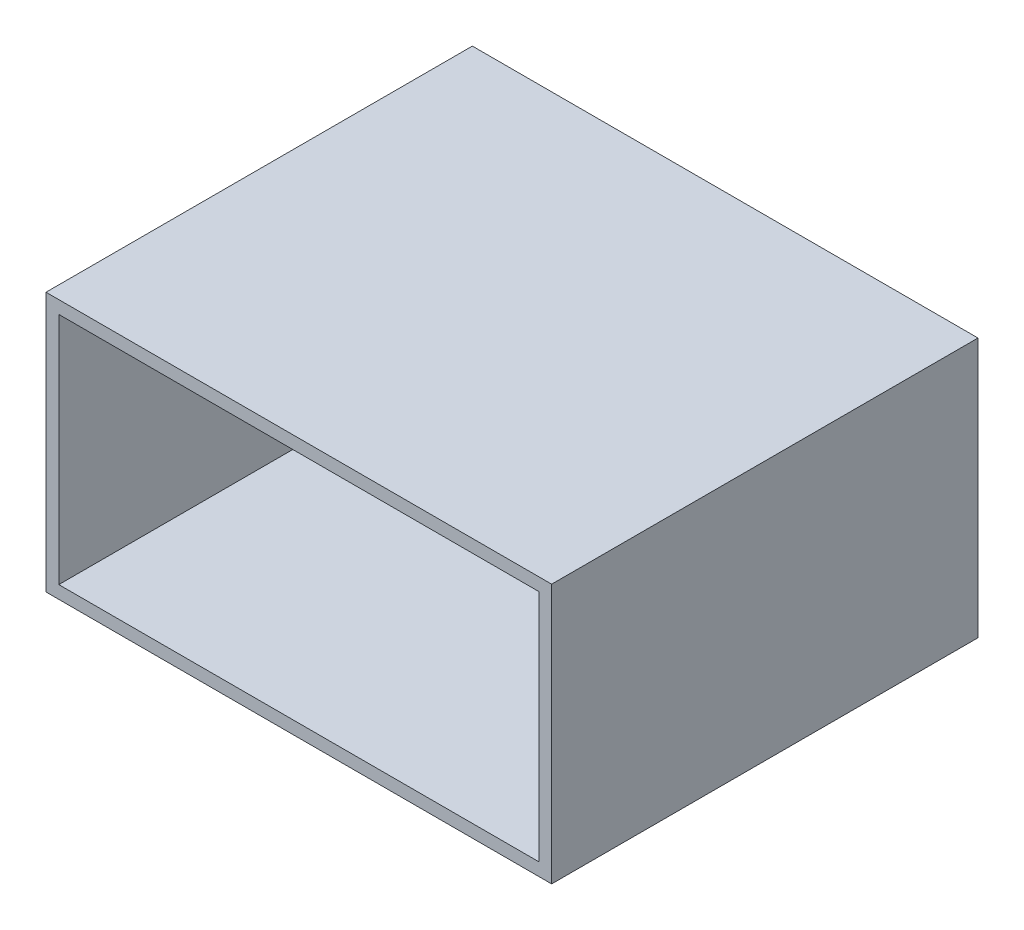
ISO-10303-21;
HEADER;
FILE_DESCRIPTION(('STEP AP214'),'2;1');
FILE_NAME('part.step','',(''),(''),'','','');
FILE_SCHEMA(('AUTOMOTIVE_DESIGN { 1 0 10303 214 1 1 1 1 }'));
ENDSEC;
DATA;
#1=APPLICATION_CONTEXT('core data for automotive mechanical design processes');
#2=APPLICATION_PROTOCOL_DEFINITION('international standard','automotive_design',2000,#1);
#3=PRODUCT_CONTEXT('',#1,'mechanical');
#4=PRODUCT('Part','Part','',(#3));
#5=PRODUCT_RELATED_PRODUCT_CATEGORY('part','',(#4));
#6=PRODUCT_DEFINITION_FORMATION('','',#4);
#7=PRODUCT_DEFINITION_CONTEXT('part definition',#1,'design');
#8=PRODUCT_DEFINITION('design','',#6,#7);
#9=PRODUCT_DEFINITION_SHAPE('','',#8);
#10=(LENGTH_UNIT() NAMED_UNIT(*) SI_UNIT(.MILLI.,.METRE.));
#11=(NAMED_UNIT(*) PLANE_ANGLE_UNIT() SI_UNIT($,.RADIAN.));
#12=(NAMED_UNIT(*) SI_UNIT($,.STERADIAN.) SOLID_ANGLE_UNIT());
#13=UNCERTAINTY_MEASURE_WITH_UNIT(LENGTH_MEASURE(1.E-05),#10,'distance_accuracy_value','');
#14=(GEOMETRIC_REPRESENTATION_CONTEXT(3) GLOBAL_UNCERTAINTY_ASSIGNED_CONTEXT((#13)) GLOBAL_UNIT_ASSIGNED_CONTEXT((#10,
#11,#12)) REPRESENTATION_CONTEXT('',''));
#15=CARTESIAN_POINT('',(0.,0.,0.));
#16=DIRECTION('',(0.,0.,1.));
#17=DIRECTION('',(1.,0.,0.));
#18=AXIS2_PLACEMENT_3D('',#15,#16,#17);
#19=CARTESIAN_POINT('',(10.,0.,333.));
#20=DIRECTION('',(1.,0.,0.));
#21=DIRECTION('',(0.,0.,-1.));
#22=AXIS2_PLACEMENT_3D('',#19,#20,#21);
#23=PLANE('',#22);
#24=DIRECTION('',(0.,-1.,0.));
#25=VECTOR('',#24,1.);
#26=CARTESIAN_POINT('',(10.,0.,10.));
#27=LINE('',#26,#25);
#28=CARTESIAN_POINT('',(10.,192.769674437008,10.));
#29=VERTEX_POINT('',#28);
#30=CARTESIAN_POINT('',(10.,10.,10.));
#31=VERTEX_POINT('',#30);
#32=EDGE_CURVE('E207',#29,#31,#27,.T.);
#33=ORIENTED_EDGE('',*,*,#32,.F.);
#34=DIRECTION('',(0.,0.,-1.));
#35=VECTOR('',#34,1.);
#36=CARTESIAN_POINT('',(10.,192.769674437008,333.));
#37=LINE('',#36,#35);
#38=CARTESIAN_POINT('',(10.,192.769674437008,333.));
#39=VERTEX_POINT('',#38);
#40=EDGE_CURVE('E216',#39,#29,#37,.T.);
#41=ORIENTED_EDGE('',*,*,#40,.F.);
#42=DIRECTION('',(0.,-1.,0.));
#43=VECTOR('',#42,1.);
#44=CARTESIAN_POINT('',(10.,0.,333.));
#45=LINE('',#44,#43);
#46=CARTESIAN_POINT('',(10.,10.,333.));
#47=VERTEX_POINT('',#46);
#48=EDGE_CURVE('E230',#39,#47,#45,.T.);
#49=ORIENTED_EDGE('',*,*,#48,.T.);
#50=DIRECTION('',(0.,0.,-1.));
#51=VECTOR('',#50,1.);
#52=CARTESIAN_POINT('',(10.,10.,333.));
#53=LINE('',#52,#51);
#54=EDGE_CURVE('E211',#47,#31,#53,.T.);
#55=ORIENTED_EDGE('',*,*,#54,.T.);
#56=EDGE_LOOP('',(#33,#41,#49,#55));
#57=FACE_BOUND('',#56,.T.);
#58=DIRECTION('',(0.,0.,-1.));
#59=VECTOR('',#58,1.);
#60=CARTESIAN_POINT('',(10.,57.9602407244175,173.5));
#61=LINE('',#60,#59);
#62=CARTESIAN_POINT('',(10.,57.9602407244175,173.5));
#63=VERTEX_POINT('',#62);
#64=CARTESIAN_POINT('',(10.,57.9602407244175,159.5));
#65=VERTEX_POINT('',#64);
#66=EDGE_CURVE('E56',#63,#65,#61,.T.);
#67=ORIENTED_EDGE('',*,*,#66,.F.);
#68=DIRECTION('',(0.,-1.,0.));
#69=VECTOR('',#68,1.);
#70=CARTESIAN_POINT('',(10.,57.9602407244175,173.5));
#71=LINE('',#70,#69);
#72=CARTESIAN_POINT('',(10.,128.355944405283,173.5));
#73=VERTEX_POINT('',#72);
#74=EDGE_CURVE('E180',#73,#63,#71,.T.);
#75=ORIENTED_EDGE('',*,*,#74,.F.);
#76=DIRECTION('',(0.,0.,-1.));
#77=VECTOR('',#76,1.);
#78=CARTESIAN_POINT('',(10.,128.355944405283,173.5));
#79=LINE('',#78,#77);
#80=CARTESIAN_POINT('',(10.,128.355944405283,159.5));
#81=VERTEX_POINT('',#80);
#82=EDGE_CURVE('E191',#73,#81,#79,.T.);
#83=ORIENTED_EDGE('',*,*,#82,.T.);
#84=DIRECTION('',(0.,-1.,0.));
#85=VECTOR('',#84,1.);
#86=CARTESIAN_POINT('',(10.,57.9602407244175,159.5));
#87=LINE('',#86,#85);
#88=EDGE_CURVE('E178',#81,#65,#87,.T.);
#89=ORIENTED_EDGE('',*,*,#88,.T.);
#90=EDGE_LOOP('',(#67,#75,#83,#89));
#91=FACE_BOUND('',#90,.T.);
#92=ADVANCED_FACE('F33',(#57,#91),#23,.T.);
#93=CARTESIAN_POINT('',(0.,0.,333.));
#94=DIRECTION('',(0.,0.,-1.));
#95=DIRECTION('',(-1.,0.,0.));
#96=AXIS2_PLACEMENT_3D('',#93,#94,#95);
#97=PLANE('',#96);
#98=DIRECTION('',(0.,-1.,0.));
#99=VECTOR('',#98,1.);
#100=CARTESIAN_POINT('',(0.,0.,333.));
#101=LINE('',#100,#99);
#102=CARTESIAN_POINT('',(0.,202.769674437008,333.));
#103=VERTEX_POINT('',#102);
#104=CARTESIAN_POINT('',(0.,0.,333.));
#105=VERTEX_POINT('',#104);
#106=EDGE_CURVE('E238',#103,#105,#101,.T.);
#107=ORIENTED_EDGE('',*,*,#106,.T.);
#108=DIRECTION('',(1.,0.,0.));
#109=VECTOR('',#108,1.);
#110=CARTESIAN_POINT('',(0.,0.,333.));
#111=LINE('',#110,#109);
#112=CARTESIAN_POINT('',(394.926652774572,0.,333.));
#113=VERTEX_POINT('',#112);
#114=EDGE_CURVE('E241',#105,#113,#111,.T.);
#115=ORIENTED_EDGE('',*,*,#114,.T.);
#116=DIRECTION('',(0.,1.,0.));
#117=VECTOR('',#116,1.);
#118=CARTESIAN_POINT('',(394.926652774572,0.,333.));
#119=LINE('',#118,#117);
#120=CARTESIAN_POINT('',(394.926652774572,202.769674437008,333.));
#121=VERTEX_POINT('',#120);
#122=EDGE_CURVE('E244',#113,#121,#119,.T.);
#123=ORIENTED_EDGE('',*,*,#122,.T.);
#124=DIRECTION('',(-1.,0.,0.));
#125=VECTOR('',#124,1.);
#126=CARTESIAN_POINT('',(0.,202.769674437008,333.));
#127=LINE('',#126,#125);
#128=EDGE_CURVE('E246',#121,#103,#127,.T.);
#129=ORIENTED_EDGE('',*,*,#128,.T.);
#130=EDGE_LOOP('',(#107,#115,#123,#129));
#131=FACE_BOUND('',#130,.T.);
#132=ORIENTED_EDGE('',*,*,#48,.F.);
#133=DIRECTION('',(-1.,0.,0.));
#134=VECTOR('',#133,1.);
#135=CARTESIAN_POINT('',(0.,192.769674437008,333.));
#136=LINE('',#135,#134);
#137=CARTESIAN_POINT('',(384.926652774572,192.769674437008,333.));
#138=VERTEX_POINT('',#137);
#139=EDGE_CURVE('E220',#138,#39,#136,.T.);
#140=ORIENTED_EDGE('',*,*,#139,.F.);
#141=DIRECTION('',(0.,1.,0.));
#142=VECTOR('',#141,1.);
#143=CARTESIAN_POINT('',(384.926652774572,0.,333.));
#144=LINE('',#143,#142);
#145=CARTESIAN_POINT('',(384.926652774572,10.,333.));
#146=VERTEX_POINT('',#145);
#147=EDGE_CURVE('E234',#146,#138,#144,.T.);
#148=ORIENTED_EDGE('',*,*,#147,.F.);
#149=DIRECTION('',(1.,0.,0.));
#150=VECTOR('',#149,1.);
#151=CARTESIAN_POINT('',(0.,10.,333.));
#152=LINE('',#151,#150);
#153=EDGE_CURVE('E232',#47,#146,#152,.T.);
#154=ORIENTED_EDGE('',*,*,#153,.F.);
#155=EDGE_LOOP('',(#132,#140,#148,#154));
#156=FACE_BOUND('',#155,.T.);
#157=ADVANCED_FACE('F280',(#131,#156),#97,.F.);
#158=CARTESIAN_POINT('',(0.,0.,333.));
#159=DIRECTION('',(1.,0.,0.));
#160=DIRECTION('',(0.,0.,-1.));
#161=AXIS2_PLACEMENT_3D('',#158,#159,#160);
#162=PLANE('',#161);
#163=DIRECTION('',(0.,-1.,0.));
#164=VECTOR('',#163,1.);
#165=CARTESIAN_POINT('',(0.,0.,0.));
#166=LINE('',#165,#164);
#167=CARTESIAN_POINT('',(0.,202.769674437008,0.));
#168=VERTEX_POINT('',#167);
#169=CARTESIAN_POINT('',(0.,0.,0.));
#170=VERTEX_POINT('',#169);
#171=EDGE_CURVE('E214',#168,#170,#166,.T.);
#172=ORIENTED_EDGE('',*,*,#171,.T.);
#173=DIRECTION('',(0.,0.,-1.));
#174=VECTOR('',#173,1.);
#175=CARTESIAN_POINT('',(0.,0.,333.));
#176=LINE('',#175,#174);
#177=EDGE_CURVE('E11',#105,#170,#176,.T.);
#178=ORIENTED_EDGE('',*,*,#177,.F.);
#179=ORIENTED_EDGE('',*,*,#106,.F.);
#180=DIRECTION('',(0.,0.,-1.));
#181=VECTOR('',#180,1.);
#182=CARTESIAN_POINT('',(0.,202.769674437008,333.));
#183=LINE('',#182,#181);
#184=EDGE_CURVE('E248',#103,#168,#183,.T.);
#185=ORIENTED_EDGE('',*,*,#184,.T.);
#186=EDGE_LOOP('',(#172,#178,#179,#185));
#187=FACE_BOUND('',#186,.T.);
#188=ADVANCED_FACE('F35',(#187),#162,.F.);
#189=CARTESIAN_POINT('',(0.,0.,333.));
#190=DIRECTION('',(0.,1.,0.));
#191=DIRECTION('',(0.,0.,1.));
#192=AXIS2_PLACEMENT_3D('',#189,#190,#191);
#193=PLANE('',#192);
#194=DIRECTION('',(1.,0.,0.));
#195=VECTOR('',#194,1.);
#196=CARTESIAN_POINT('',(0.,0.,0.));
#197=LINE('',#196,#195);
#198=CARTESIAN_POINT('',(394.926652774572,0.,0.));
#199=VERTEX_POINT('',#198);
#200=EDGE_CURVE('E251',#170,#199,#197,.T.);
#201=ORIENTED_EDGE('',*,*,#200,.T.);
#202=DIRECTION('',(0.,0.,-1.));
#203=VECTOR('',#202,1.);
#204=CARTESIAN_POINT('',(394.926652774572,0.,333.));
#205=LINE('',#204,#203);
#206=EDGE_CURVE('E41',#113,#199,#205,.T.);
#207=ORIENTED_EDGE('',*,*,#206,.F.);
#208=ORIENTED_EDGE('',*,*,#114,.F.);
#209=ORIENTED_EDGE('',*,*,#177,.T.);
#210=EDGE_LOOP('',(#201,#207,#208,#209));
#211=FACE_BOUND('',#210,.T.);
#212=ADVANCED_FACE('F282',(#211),#193,.F.);
#213=CARTESIAN_POINT('',(394.926652774572,0.,333.));
#214=DIRECTION('',(-1.,0.,0.));
#215=DIRECTION('',(0.,0.,1.));
#216=AXIS2_PLACEMENT_3D('',#213,#214,#215);
#217=PLANE('',#216);
#218=DIRECTION('',(0.,1.,0.));
#219=VECTOR('',#218,1.);
#220=CARTESIAN_POINT('',(394.926652774572,0.,0.));
#221=LINE('',#220,#219);
#222=CARTESIAN_POINT('',(394.926652774572,202.769674437008,0.));
#223=VERTEX_POINT('',#222);
#224=EDGE_CURVE('E253',#199,#223,#221,.T.);
#225=ORIENTED_EDGE('',*,*,#224,.T.);
#226=DIRECTION('',(0.,0.,-1.));
#227=VECTOR('',#226,1.);
#228=CARTESIAN_POINT('',(394.926652774572,202.769674437008,333.));
#229=LINE('',#228,#227);
#230=EDGE_CURVE('E258',#121,#223,#229,.T.);
#231=ORIENTED_EDGE('',*,*,#230,.F.);
#232=ORIENTED_EDGE('',*,*,#122,.F.);
#233=ORIENTED_EDGE('',*,*,#206,.T.);
#234=EDGE_LOOP('',(#225,#231,#232,#233));
#235=FACE_BOUND('',#234,.T.);
#236=ADVANCED_FACE('F265',(#235),#217,.F.);
#237=CARTESIAN_POINT('',(0.,202.769674437008,333.));
#238=DIRECTION('',(0.,-1.,0.));
#239=DIRECTION('',(0.,0.,-1.));
#240=AXIS2_PLACEMENT_3D('',#237,#238,#239);
#241=PLANE('',#240);
#242=DIRECTION('',(-1.,0.,0.));
#243=VECTOR('',#242,1.);
#244=CARTESIAN_POINT('',(0.,202.769674437008,0.));
#245=LINE('',#244,#243);
#246=EDGE_CURVE('E242',#223,#168,#245,.T.);
#247=ORIENTED_EDGE('',*,*,#246,.T.);
#248=ORIENTED_EDGE('',*,*,#184,.F.);
#249=ORIENTED_EDGE('',*,*,#128,.F.);
#250=ORIENTED_EDGE('',*,*,#230,.T.);
#251=EDGE_LOOP('',(#247,#248,#249,#250));
#252=FACE_BOUND('',#251,.T.);
#253=ADVANCED_FACE('F274',(#252),#241,.F.);
#254=CARTESIAN_POINT('',(0.,0.,0.));
#255=DIRECTION('',(0.,0.,-1.));
#256=DIRECTION('',(-1.,0.,0.));
#257=AXIS2_PLACEMENT_3D('',#254,#255,#256);
#258=PLANE('',#257);
#259=ORIENTED_EDGE('',*,*,#171,.F.);
#260=ORIENTED_EDGE('',*,*,#246,.F.);
#261=ORIENTED_EDGE('',*,*,#224,.F.);
#262=ORIENTED_EDGE('',*,*,#200,.F.);
#263=EDGE_LOOP('',(#259,#260,#261,#262));
#264=FACE_BOUND('',#263,.T.);
#265=ADVANCED_FACE('F271',(#264),#258,.T.);
#266=CARTESIAN_POINT('',(0.,10.,333.));
#267=DIRECTION('',(0.,1.,0.));
#268=DIRECTION('',(0.,0.,1.));
#269=AXIS2_PLACEMENT_3D('',#266,#267,#268);
#270=PLANE('',#269);
#271=DIRECTION('',(1.,0.,0.));
#272=VECTOR('',#271,1.);
#273=CARTESIAN_POINT('',(0.,10.,10.));
#274=LINE('',#273,#272);
#275=CARTESIAN_POINT('',(384.926652774572,10.,10.));
#276=VERTEX_POINT('',#275);
#277=EDGE_CURVE('E210',#31,#276,#274,.T.);
#278=ORIENTED_EDGE('',*,*,#277,.F.);
#279=ORIENTED_EDGE('',*,*,#54,.F.);
#280=ORIENTED_EDGE('',*,*,#153,.T.);
#281=DIRECTION('',(0.,0.,-1.));
#282=VECTOR('',#281,1.);
#283=CARTESIAN_POINT('',(384.926652774572,10.,333.));
#284=LINE('',#283,#282);
#285=EDGE_CURVE('E215',#146,#276,#284,.T.);
#286=ORIENTED_EDGE('',*,*,#285,.T.);
#287=EDGE_LOOP('',(#278,#279,#280,#286));
#288=FACE_BOUND('',#287,.T.);
#289=ADVANCED_FACE('F301',(#288),#270,.T.);
#290=CARTESIAN_POINT('',(384.926652774572,0.,333.));
#291=DIRECTION('',(-1.,0.,0.));
#292=DIRECTION('',(0.,0.,1.));
#293=AXIS2_PLACEMENT_3D('',#290,#291,#292);
#294=PLANE('',#293);
#295=DIRECTION('',(0.,1.,0.));
#296=VECTOR('',#295,1.);
#297=CARTESIAN_POINT('',(384.926652774572,59.3820183864008,173.5));
#298=LINE('',#297,#296);
#299=CARTESIAN_POINT('',(384.926652774572,59.3820183864008,173.5));
#300=VERTEX_POINT('',#299);
#301=CARTESIAN_POINT('',(384.926652774572,128.355944405283,173.5));
#302=VERTEX_POINT('',#301);
#303=EDGE_CURVE('E152',#300,#302,#298,.T.);
#304=ORIENTED_EDGE('',*,*,#303,.F.);
#305=DIRECTION('',(0.,0.,-1.));
#306=VECTOR('',#305,1.);
#307=CARTESIAN_POINT('',(384.926652774572,59.3820183864008,173.5));
#308=LINE('',#307,#306);
#309=CARTESIAN_POINT('',(384.926652774572,59.3820183864008,159.5));
#310=VERTEX_POINT('',#309);
#311=EDGE_CURVE('E506',#300,#310,#308,.T.);
#312=ORIENTED_EDGE('',*,*,#311,.T.);
#313=DIRECTION('',(0.,1.,0.));
#314=VECTOR('',#313,1.);
#315=CARTESIAN_POINT('',(384.926652774572,59.3820183864008,159.5));
#316=LINE('',#315,#314);
#317=CARTESIAN_POINT('',(384.926652774572,128.355944405283,159.5));
#318=VERTEX_POINT('',#317);
#319=EDGE_CURVE('E167',#310,#318,#316,.T.);
#320=ORIENTED_EDGE('',*,*,#319,.T.);
#321=DIRECTION('',(0.,0.,-1.));
#322=VECTOR('',#321,1.);
#323=CARTESIAN_POINT('',(384.926652774572,128.355944405283,173.5));
#324=LINE('',#323,#322);
#325=EDGE_CURVE('E48',#302,#318,#324,.T.);
#326=ORIENTED_EDGE('',*,*,#325,.F.);
#327=EDGE_LOOP('',(#304,#312,#320,#326));
#328=FACE_BOUND('',#327,.T.);
#329=DIRECTION('',(0.,1.,0.));
#330=VECTOR('',#329,1.);
#331=CARTESIAN_POINT('',(384.926652774572,0.,10.));
#332=LINE('',#331,#330);
#333=CARTESIAN_POINT('',(384.926652774572,192.769674437008,10.));
#334=VERTEX_POINT('',#333);
#335=EDGE_CURVE('E222',#276,#334,#332,.T.);
#336=ORIENTED_EDGE('',*,*,#335,.F.);
#337=ORIENTED_EDGE('',*,*,#285,.F.);
#338=ORIENTED_EDGE('',*,*,#147,.T.);
#339=DIRECTION('',(0.,0.,-1.));
#340=VECTOR('',#339,1.);
#341=CARTESIAN_POINT('',(384.926652774572,192.769674437008,333.));
#342=LINE('',#341,#340);
#343=EDGE_CURVE('E219',#138,#334,#342,.T.);
#344=ORIENTED_EDGE('',*,*,#343,.T.);
#345=EDGE_LOOP('',(#336,#337,#338,#344));
#346=FACE_BOUND('',#345,.T.);
#347=ADVANCED_FACE('F164',(#328,#346),#294,.T.);
#348=CARTESIAN_POINT('',(0.,192.769674437008,333.));
#349=DIRECTION('',(0.,-1.,0.));
#350=DIRECTION('',(0.,0.,-1.));
#351=AXIS2_PLACEMENT_3D('',#348,#349,#350);
#352=PLANE('',#351);
#353=DIRECTION('',(-1.,0.,0.));
#354=VECTOR('',#353,1.);
#355=CARTESIAN_POINT('',(0.,192.769674437008,10.));
#356=LINE('',#355,#354);
#357=EDGE_CURVE('E226',#334,#29,#356,.T.);
#358=ORIENTED_EDGE('',*,*,#357,.F.);
#359=ORIENTED_EDGE('',*,*,#343,.F.);
#360=ORIENTED_EDGE('',*,*,#139,.T.);
#361=ORIENTED_EDGE('',*,*,#40,.T.);
#362=EDGE_LOOP('',(#358,#359,#360,#361));
#363=FACE_BOUND('',#362,.T.);
#364=ADVANCED_FACE('F307',(#363),#352,.T.);
#365=CARTESIAN_POINT('',(0.,0.,10.));
#366=DIRECTION('',(0.,0.,-1.));
#367=DIRECTION('',(-1.,0.,0.));
#368=AXIS2_PLACEMENT_3D('',#365,#366,#367);
#369=PLANE('',#368);
#370=ORIENTED_EDGE('',*,*,#32,.T.);
#371=ORIENTED_EDGE('',*,*,#277,.T.);
#372=ORIENTED_EDGE('',*,*,#335,.T.);
#373=ORIENTED_EDGE('',*,*,#357,.T.);
#374=EDGE_LOOP('',(#370,#371,#372,#373));
#375=FACE_BOUND('',#374,.T.);
#376=ADVANCED_FACE('F310',(#375),#369,.F.);
#377=CARTESIAN_POINT('',(81.8144397387029,57.9602407244175,173.5));
#378=DIRECTION('',(0.,1.,0.));
#379=DIRECTION('',(-1.,0.,0.));
#380=AXIS2_PLACEMENT_3D('',#377,#378,#379);
#381=PLANE('',#380);
#382=DIRECTION('',(1.,0.,0.));
#383=VECTOR('',#382,1.);
#384=CARTESIAN_POINT('',(81.8144397387029,57.9602407244175,159.5));
#385=LINE('',#384,#383);
#386=CARTESIAN_POINT('',(81.8144397387029,57.9602407244175,159.5));
#387=VERTEX_POINT('',#386);
#388=EDGE_CURVE('E193',#65,#387,#385,.T.);
#389=ORIENTED_EDGE('',*,*,#388,.T.);
#390=DIRECTION('',(0.,0.,-1.));
#391=VECTOR('',#390,1.);
#392=CARTESIAN_POINT('',(81.8144397387029,57.9602407244175,173.5));
#393=LINE('',#392,#391);
#394=CARTESIAN_POINT('',(81.8144397387029,57.9602407244175,173.5));
#395=VERTEX_POINT('',#394);
#396=EDGE_CURVE('E203',#395,#387,#393,.T.);
#397=ORIENTED_EDGE('',*,*,#396,.F.);
#398=DIRECTION('',(1.,0.,0.));
#399=VECTOR('',#398,1.);
#400=CARTESIAN_POINT('',(81.8144397387029,57.9602407244175,173.5));
#401=LINE('',#400,#399);
#402=EDGE_CURVE('E183',#63,#395,#401,.T.);
#403=ORIENTED_EDGE('',*,*,#402,.F.);
#404=ORIENTED_EDGE('',*,*,#66,.T.);
#405=EDGE_LOOP('',(#389,#397,#403,#404));
#406=FACE_BOUND('',#405,.T.);
#407=ADVANCED_FACE('F299',(#406),#381,.F.);
#408=CARTESIAN_POINT('',(81.8144397387029,93.1580925648501,173.5));
#409=DIRECTION('',(0.,0.,-1.));
#410=DIRECTION('',(-1.,0.,0.));
#411=AXIS2_PLACEMENT_3D('',#408,#409,#410);
#412=CYLINDRICAL_SURFACE('',#411,35.1978518404327);
#413=CARTESIAN_POINT('',(81.8144397387029,93.1580925648501,159.5));
#414=DIRECTION('',(0.,0.,1.));
#415=DIRECTION('',(-1.,0.,0.));
#416=AXIS2_PLACEMENT_3D('',#413,#414,#415);
#417=CIRCLE('',#416,35.1978518404327);
#418=CARTESIAN_POINT('',(81.8144397387029,128.355944405283,159.5));
#419=VERTEX_POINT('',#418);
#420=EDGE_CURVE('E195',#387,#419,#417,.T.);
#421=ORIENTED_EDGE('',*,*,#420,.T.);
#422=DIRECTION('',(0.,0.,-1.));
#423=VECTOR('',#422,1.);
#424=CARTESIAN_POINT('',(81.8144397387029,128.355944405283,173.5));
#425=LINE('',#424,#423);
#426=CARTESIAN_POINT('',(81.8144397387029,128.355944405283,173.5));
#427=VERTEX_POINT('',#426);
#428=EDGE_CURVE('E200',#427,#419,#425,.T.);
#429=ORIENTED_EDGE('',*,*,#428,.F.);
#430=CARTESIAN_POINT('',(81.8144397387029,93.1580925648501,173.5));
#431=DIRECTION('',(0.,0.,1.));
#432=DIRECTION('',(-1.,0.,0.));
#433=AXIS2_PLACEMENT_3D('',#430,#431,#432);
#434=CIRCLE('',#433,35.1978518404327);
#435=EDGE_CURVE('E186',#395,#427,#434,.T.);
#436=ORIENTED_EDGE('',*,*,#435,.F.);
#437=ORIENTED_EDGE('',*,*,#396,.T.);
#438=EDGE_LOOP('',(#421,#429,#436,#437));
#439=FACE_BOUND('',#438,.T.);
#440=ADVANCED_FACE('F351',(#439),#412,.T.);
#441=CARTESIAN_POINT('',(10.,128.355944405283,173.5));
#442=DIRECTION('',(0.,-1.,0.));
#443=DIRECTION('',(0.,0.,-1.));
#444=AXIS2_PLACEMENT_3D('',#441,#442,#443);
#445=PLANE('',#444);
#446=DIRECTION('',(-1.,0.,0.));
#447=VECTOR('',#446,1.);
#448=CARTESIAN_POINT('',(10.,128.355944405283,159.5));
#449=LINE('',#448,#447);
#450=EDGE_CURVE('E184',#419,#81,#449,.T.);
#451=ORIENTED_EDGE('',*,*,#450,.T.);
#452=ORIENTED_EDGE('',*,*,#82,.F.);
#453=DIRECTION('',(-1.,0.,0.));
#454=VECTOR('',#453,1.);
#455=CARTESIAN_POINT('',(10.,128.355944405283,173.5));
#456=LINE('',#455,#454);
#457=EDGE_CURVE('E188',#427,#73,#456,.T.);
#458=ORIENTED_EDGE('',*,*,#457,.F.);
#459=ORIENTED_EDGE('',*,*,#428,.T.);
#460=EDGE_LOOP('',(#451,#452,#458,#459));
#461=FACE_BOUND('',#460,.T.);
#462=ADVANCED_FACE('F358',(#461),#445,.F.);
#463=CARTESIAN_POINT('',(81.8144397387029,93.1580925648501,173.5));
#464=DIRECTION('',(0.,0.,-1.));
#465=DIRECTION('',(-1.,0.,0.));
#466=AXIS2_PLACEMENT_3D('',#463,#464,#465);
#467=PLANE('',#466);
#468=CARTESIAN_POINT('',(81.8144397387029,93.1580925648501,173.5));
#469=DIRECTION('',(0.,0.,1.));
#470=DIRECTION('',(1.,0.,0.));
#471=AXIS2_PLACEMENT_3D('',#468,#469,#470);
#472=CIRCLE('',#471,24.9230372604122);
#473=CARTESIAN_POINT('',(106.737476999115,93.1580925648501,173.5));
#474=VERTEX_POINT('',#473);
#475=EDGE_CURVE('E168',#474,#474,#472,.T.);
#476=ORIENTED_EDGE('',*,*,#475,.F.);
#477=EDGE_LOOP('',(#476));
#478=FACE_BOUND('',#477,.T.);
#479=ORIENTED_EDGE('',*,*,#74,.T.);
#480=ORIENTED_EDGE('',*,*,#402,.T.);
#481=ORIENTED_EDGE('',*,*,#435,.T.);
#482=ORIENTED_EDGE('',*,*,#457,.T.);
#483=EDGE_LOOP('',(#479,#480,#481,#482));
#484=FACE_BOUND('',#483,.T.);
#485=ADVANCED_FACE('F365',(#478,#484),#467,.F.);
#486=CARTESIAN_POINT('',(81.8144397387029,93.1580925648501,159.5));
#487=DIRECTION('',(0.,0.,-1.));
#488=DIRECTION('',(-1.,0.,0.));
#489=AXIS2_PLACEMENT_3D('',#486,#487,#488);
#490=PLANE('',#489);
#491=CARTESIAN_POINT('',(81.8144397387029,93.1580925648501,159.5));
#492=DIRECTION('',(0.,0.,1.));
#493=DIRECTION('',(1.,0.,0.));
#494=AXIS2_PLACEMENT_3D('',#491,#492,#493);
#495=CIRCLE('',#494,24.9230372604122);
#496=CARTESIAN_POINT('',(106.737476999115,93.1580925648501,159.5));
#497=VERTEX_POINT('',#496);
#498=EDGE_CURVE('E171',#497,#497,#495,.T.);
#499=ORIENTED_EDGE('',*,*,#498,.T.);
#500=EDGE_LOOP('',(#499));
#501=FACE_BOUND('',#500,.T.);
#502=ORIENTED_EDGE('',*,*,#88,.F.);
#503=ORIENTED_EDGE('',*,*,#450,.F.);
#504=ORIENTED_EDGE('',*,*,#420,.F.);
#505=ORIENTED_EDGE('',*,*,#388,.F.);
#506=EDGE_LOOP('',(#502,#503,#504,#505));
#507=FACE_BOUND('',#506,.T.);
#508=ADVANCED_FACE('F373',(#501,#507),#490,.T.);
#509=CARTESIAN_POINT('',(81.8144397387029,93.1580925648501,159.5));
#510=DIRECTION('',(0.,0.,1.));
#511=DIRECTION('',(1.,0.,0.));
#512=AXIS2_PLACEMENT_3D('',#509,#510,#511);
#513=CYLINDRICAL_SURFACE('',#512,24.9230372604122);
#514=ORIENTED_EDGE('',*,*,#498,.F.);
#515=EDGE_LOOP('',(#514));
#516=FACE_BOUND('',#515,.T.);
#517=ORIENTED_EDGE('',*,*,#475,.T.);
#518=EDGE_LOOP('',(#517));
#519=FACE_BOUND('',#518,.T.);
#520=ADVANCED_FACE('F381',(#516,#519),#513,.F.);
#521=CARTESIAN_POINT('',(384.926652774572,128.355944405283,173.5));
#522=DIRECTION('',(0.,-1.,0.));
#523=DIRECTION('',(0.,0.,-1.));
#524=AXIS2_PLACEMENT_3D('',#521,#522,#523);
#525=PLANE('',#524);
#526=DIRECTION('',(-1.,0.,0.));
#527=VECTOR('',#526,1.);
#528=CARTESIAN_POINT('',(384.926652774572,128.355944405283,159.5));
#529=LINE('',#528,#527);
#530=CARTESIAN_POINT('',(291.10895525886,128.355944405283,159.5));
#531=VERTEX_POINT('',#530);
#532=EDGE_CURVE('E508',#318,#531,#529,.T.);
#533=ORIENTED_EDGE('',*,*,#532,.T.);
#534=DIRECTION('',(0.,0.,-1.));
#535=VECTOR('',#534,1.);
#536=CARTESIAN_POINT('',(291.10895525886,128.355944405283,173.5));
#537=LINE('',#536,#535);
#538=CARTESIAN_POINT('',(291.10895525886,128.355944405283,173.5));
#539=VERTEX_POINT('',#538);
#540=EDGE_CURVE('E148',#539,#531,#537,.T.);
#541=ORIENTED_EDGE('',*,*,#540,.F.);
#542=DIRECTION('',(-1.,0.,0.));
#543=VECTOR('',#542,1.);
#544=CARTESIAN_POINT('',(384.926652774572,128.355944405283,173.5));
#545=LINE('',#544,#543);
#546=EDGE_CURVE('E144',#302,#539,#545,.T.);
#547=ORIENTED_EDGE('',*,*,#546,.F.);
#548=ORIENTED_EDGE('',*,*,#325,.T.);
#549=EDGE_LOOP('',(#533,#541,#547,#548));
#550=FACE_BOUND('',#549,.T.);
#551=ADVANCED_FACE('F146',(#550),#525,.F.);
#552=CARTESIAN_POINT('',(291.10895525886,93.8689813958418,173.5));
#553=DIRECTION('',(0.,0.,-1.));
#554=DIRECTION('',(-1.,0.,0.));
#555=AXIS2_PLACEMENT_3D('',#552,#553,#554);
#556=CYLINDRICAL_SURFACE('',#555,34.486963009441);
#557=CARTESIAN_POINT('',(291.10895525886,93.8689813958418,159.5));
#558=DIRECTION('',(0.,0.,1.));
#559=DIRECTION('',(1.,0.,0.));
#560=AXIS2_PLACEMENT_3D('',#557,#558,#559);
#561=CIRCLE('',#560,34.486963009441);
#562=CARTESIAN_POINT('',(291.10895525886,59.3820183864008,159.5));
#563=VERTEX_POINT('',#562);
#564=EDGE_CURVE('E510',#531,#563,#561,.T.);
#565=ORIENTED_EDGE('',*,*,#564,.T.);
#566=DIRECTION('',(0.,0.,-1.));
#567=VECTOR('',#566,1.);
#568=CARTESIAN_POINT('',(291.10895525886,59.3820183864008,173.5));
#569=LINE('',#568,#567);
#570=CARTESIAN_POINT('',(291.10895525886,59.3820183864008,173.5));
#571=VERTEX_POINT('',#570);
#572=EDGE_CURVE('E173',#571,#563,#569,.T.);
#573=ORIENTED_EDGE('',*,*,#572,.F.);
#574=CARTESIAN_POINT('',(291.10895525886,93.8689813958418,173.5));
#575=DIRECTION('',(0.,0.,1.));
#576=DIRECTION('',(1.,0.,0.));
#577=AXIS2_PLACEMENT_3D('',#574,#575,#576);
#578=CIRCLE('',#577,34.486963009441);
#579=EDGE_CURVE('E151',#539,#571,#578,.T.);
#580=ORIENTED_EDGE('',*,*,#579,.F.);
#581=ORIENTED_EDGE('',*,*,#540,.T.);
#582=EDGE_LOOP('',(#565,#573,#580,#581));
#583=FACE_BOUND('',#582,.T.);
#584=ADVANCED_FACE('F394',(#583),#556,.T.);
#585=CARTESIAN_POINT('',(291.10895525886,59.3820183864008,173.5));
#586=DIRECTION('',(0.,1.,0.));
#587=DIRECTION('',(0.,0.,1.));
#588=AXIS2_PLACEMENT_3D('',#585,#586,#587);
#589=PLANE('',#588);
#590=DIRECTION('',(1.,0.,0.));
#591=VECTOR('',#590,1.);
#592=CARTESIAN_POINT('',(291.10895525886,59.3820183864008,159.5));
#593=LINE('',#592,#591);
#594=EDGE_CURVE('E161',#563,#310,#593,.T.);
#595=ORIENTED_EDGE('',*,*,#594,.T.);
#596=ORIENTED_EDGE('',*,*,#311,.F.);
#597=DIRECTION('',(1.,0.,0.));
#598=VECTOR('',#597,1.);
#599=CARTESIAN_POINT('',(291.10895525886,59.3820183864008,173.5));
#600=LINE('',#599,#598);
#601=EDGE_CURVE('E157',#571,#300,#600,.T.);
#602=ORIENTED_EDGE('',*,*,#601,.F.);
#603=ORIENTED_EDGE('',*,*,#572,.T.);
#604=EDGE_LOOP('',(#595,#596,#602,#603));
#605=FACE_BOUND('',#604,.T.);
#606=ADVANCED_FACE('F401',(#605),#589,.F.);
#607=CARTESIAN_POINT('',(291.10895525886,93.8689813958418,173.5));
#608=DIRECTION('',(0.,0.,1.));
#609=DIRECTION('',(1.,0.,0.));
#610=AXIS2_PLACEMENT_3D('',#607,#608,#609);
#611=PLANE('',#610);
#612=CARTESIAN_POINT('',(291.10895525886,93.8689813958418,173.5));
#613=DIRECTION('',(0.,0.,1.));
#614=DIRECTION('',(1.,0.,0.));
#615=AXIS2_PLACEMENT_3D('',#612,#613,#614);
#616=CIRCLE('',#615,24.9230372604121);
#617=CARTESIAN_POINT('',(316.031992519272,93.8689813958418,173.5));
#618=VERTEX_POINT('',#617);
#619=EDGE_CURVE('E500',#618,#618,#616,.T.);
#620=ORIENTED_EDGE('',*,*,#619,.F.);
#621=EDGE_LOOP('',(#620));
#622=FACE_BOUND('',#621,.T.);
#623=ORIENTED_EDGE('',*,*,#303,.T.);
#624=ORIENTED_EDGE('',*,*,#546,.T.);
#625=ORIENTED_EDGE('',*,*,#579,.T.);
#626=ORIENTED_EDGE('',*,*,#601,.T.);
#627=EDGE_LOOP('',(#623,#624,#625,#626));
#628=FACE_BOUND('',#627,.T.);
#629=ADVANCED_FACE('F155',(#622,#628),#611,.T.);
#630=CARTESIAN_POINT('',(291.10895525886,93.8689813958418,159.5));
#631=DIRECTION('',(0.,0.,1.));
#632=DIRECTION('',(1.,0.,0.));
#633=AXIS2_PLACEMENT_3D('',#630,#631,#632);
#634=PLANE('',#633);
#635=CARTESIAN_POINT('',(291.10895525886,93.8689813958418,159.5));
#636=DIRECTION('',(0.,0.,1.));
#637=DIRECTION('',(1.,0.,0.));
#638=AXIS2_PLACEMENT_3D('',#635,#636,#637);
#639=CIRCLE('',#638,24.9230372604121);
#640=CARTESIAN_POINT('',(316.031992519272,93.8689813958418,159.5));
#641=VERTEX_POINT('',#640);
#642=EDGE_CURVE('E497',#641,#641,#639,.T.);
#643=ORIENTED_EDGE('',*,*,#642,.T.);
#644=EDGE_LOOP('',(#643));
#645=FACE_BOUND('',#644,.T.);
#646=ORIENTED_EDGE('',*,*,#319,.F.);
#647=ORIENTED_EDGE('',*,*,#594,.F.);
#648=ORIENTED_EDGE('',*,*,#564,.F.);
#649=ORIENTED_EDGE('',*,*,#532,.F.);
#650=EDGE_LOOP('',(#646,#647,#648,#649));
#651=FACE_BOUND('',#650,.T.);
#652=ADVANCED_FACE('F416',(#645,#651),#634,.F.);
#653=CARTESIAN_POINT('',(291.10895525886,93.8689813958418,159.5));
#654=DIRECTION('',(0.,0.,1.));
#655=DIRECTION('',(1.,0.,0.));
#656=AXIS2_PLACEMENT_3D('',#653,#654,#655);
#657=CYLINDRICAL_SURFACE('',#656,24.9230372604121);
#658=ORIENTED_EDGE('',*,*,#642,.F.);
#659=EDGE_LOOP('',(#658));
#660=FACE_BOUND('',#659,.T.);
#661=ORIENTED_EDGE('',*,*,#619,.T.);
#662=EDGE_LOOP('',(#661));
#663=FACE_BOUND('',#662,.T.);
#664=ADVANCED_FACE('F424',(#660,#663),#657,.F.);
#665=CLOSED_SHELL('',(#92,#157,#188,#212,#236,#253,#265,#289,#347,#364,#376,#407,#440,#462,#485,
#508,#520,#551,#584,#606,#629,#652,#664));
#666=MANIFOLD_SOLID_BREP('B2',#665);
#667=ADVANCED_BREP_SHAPE_REPRESENTATION('',(#18,#666),#14);
#668=SHAPE_DEFINITION_REPRESENTATION(#9,#667);
ENDSEC;
END-ISO-10303-21;
